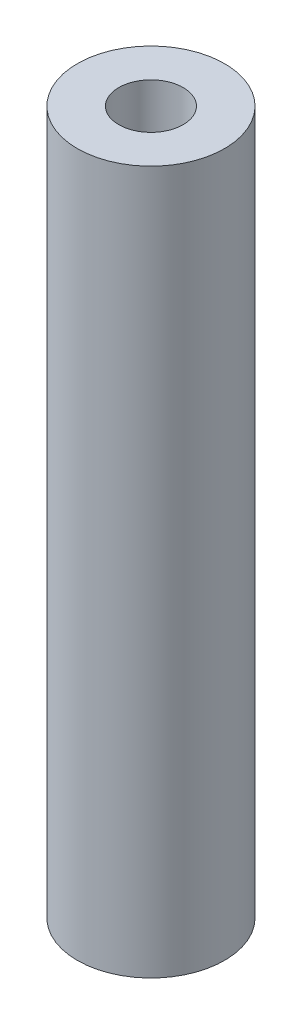
ISO-10303-21;
HEADER;
FILE_DESCRIPTION(('STEP AP214'),'2;1');
FILE_NAME('part.step','',(''),(''),'','','');
FILE_SCHEMA(('AUTOMOTIVE_DESIGN { 1 0 10303 214 1 1 1 1 }'));
ENDSEC;
DATA;
#1=APPLICATION_CONTEXT('core data for automotive mechanical design processes');
#2=APPLICATION_PROTOCOL_DEFINITION('international standard','automotive_design',2000,#1);
#3=PRODUCT_CONTEXT('',#1,'mechanical');
#4=PRODUCT('Part','Part','',(#3));
#5=PRODUCT_RELATED_PRODUCT_CATEGORY('part','',(#4));
#6=PRODUCT_DEFINITION_FORMATION('','',#4);
#7=PRODUCT_DEFINITION_CONTEXT('part definition',#1,'design');
#8=PRODUCT_DEFINITION('design','',#6,#7);
#9=PRODUCT_DEFINITION_SHAPE('','',#8);
#10=(LENGTH_UNIT() NAMED_UNIT(*) SI_UNIT(.MILLI.,.METRE.));
#11=(NAMED_UNIT(*) PLANE_ANGLE_UNIT() SI_UNIT($,.RADIAN.));
#12=(NAMED_UNIT(*) SI_UNIT($,.STERADIAN.) SOLID_ANGLE_UNIT());
#13=UNCERTAINTY_MEASURE_WITH_UNIT(LENGTH_MEASURE(1.E-05),#10,'distance_accuracy_value','');
#14=(GEOMETRIC_REPRESENTATION_CONTEXT(3) GLOBAL_UNCERTAINTY_ASSIGNED_CONTEXT((#13)) GLOBAL_UNIT_ASSIGNED_CONTEXT((#10,
#11,#12)) REPRESENTATION_CONTEXT('',''));
#15=CARTESIAN_POINT('',(0.,0.,0.));
#16=DIRECTION('',(0.,0.,1.));
#17=DIRECTION('',(1.,0.,0.));
#18=AXIS2_PLACEMENT_3D('',#15,#16,#17);
#19=CARTESIAN_POINT('',(0.,38.2,0.));
#20=DIRECTION('',(0.,1.,0.));
#21=DIRECTION('',(0.,0.,1.));
#22=AXIS2_PLACEMENT_3D('',#19,#20,#21);
#23=PLANE('',#22);
#24=CARTESIAN_POINT('',(0.,38.2,0.));
#25=DIRECTION('',(0.,1.,0.));
#26=DIRECTION('',(0.,0.,1.));
#27=AXIS2_PLACEMENT_3D('',#24,#25,#26);
#28=CIRCLE('',#27,4.);
#29=CARTESIAN_POINT('',(0.,38.2,4.));
#30=VERTEX_POINT('',#29);
#31=EDGE_CURVE('E10',#30,#30,#28,.T.);
#32=ORIENTED_EDGE('',*,*,#31,.T.);
#33=EDGE_LOOP('',(#32));
#34=FACE_BOUND('',#33,.T.);
#35=CARTESIAN_POINT('',(0.,38.2,0.));
#36=DIRECTION('',(0.,1.,0.));
#37=DIRECTION('',(0.,0.,1.));
#38=AXIS2_PLACEMENT_3D('',#35,#36,#37);
#39=CIRCLE('',#38,1.75);
#40=CARTESIAN_POINT('',(0.,38.2,1.75));
#41=VERTEX_POINT('',#40);
#42=EDGE_CURVE('E56',#41,#41,#39,.T.);
#43=ORIENTED_EDGE('',*,*,#42,.F.);
#44=EDGE_LOOP('',(#43));
#45=FACE_BOUND('',#44,.T.);
#46=ADVANCED_FACE('F43',(#34,#45),#23,.T.);
#47=CARTESIAN_POINT('',(0.,0.,0.));
#48=DIRECTION('',(0.,1.,0.));
#49=DIRECTION('',(0.,0.,1.));
#50=AXIS2_PLACEMENT_3D('',#47,#48,#49);
#51=PLANE('',#50);
#52=CARTESIAN_POINT('',(0.,0.,0.));
#53=DIRECTION('',(0.,1.,0.));
#54=DIRECTION('',(0.,0.,1.));
#55=AXIS2_PLACEMENT_3D('',#52,#53,#54);
#56=CIRCLE('',#55,4.);
#57=CARTESIAN_POINT('',(0.,0.,4.));
#58=VERTEX_POINT('',#57);
#59=EDGE_CURVE('E47',#58,#58,#56,.T.);
#60=ORIENTED_EDGE('',*,*,#59,.F.);
#61=EDGE_LOOP('',(#60));
#62=FACE_BOUND('',#61,.T.);
#63=CARTESIAN_POINT('',(0.,0.,0.));
#64=DIRECTION('',(0.,1.,0.));
#65=DIRECTION('',(0.,0.,1.));
#66=AXIS2_PLACEMENT_3D('',#63,#64,#65);
#67=CIRCLE('',#66,1.75);
#68=CARTESIAN_POINT('',(0.,0.,1.75));
#69=VERTEX_POINT('',#68);
#70=EDGE_CURVE('E58',#69,#69,#67,.T.);
#71=ORIENTED_EDGE('',*,*,#70,.T.);
#72=EDGE_LOOP('',(#71));
#73=FACE_BOUND('',#72,.T.);
#74=ADVANCED_FACE('F70',(#62,#73),#51,.F.);
#75=CARTESIAN_POINT('',(0.,38.2,0.));
#76=DIRECTION('',(0.,-1.,0.));
#77=DIRECTION('',(0.,0.,-1.));
#78=AXIS2_PLACEMENT_3D('',#75,#76,#77);
#79=CYLINDRICAL_SURFACE('',#78,4.);
#80=ORIENTED_EDGE('',*,*,#31,.F.);
#81=EDGE_LOOP('',(#80));
#82=FACE_BOUND('',#81,.T.);
#83=ORIENTED_EDGE('',*,*,#59,.T.);
#84=EDGE_LOOP('',(#83));
#85=FACE_BOUND('',#84,.T.);
#86=ADVANCED_FACE('F45',(#82,#85),#79,.T.);
#87=CARTESIAN_POINT('',(0.,38.2,0.));
#88=DIRECTION('',(0.,-1.,0.));
#89=DIRECTION('',(0.,0.,-1.));
#90=AXIS2_PLACEMENT_3D('',#87,#88,#89);
#91=CYLINDRICAL_SURFACE('',#90,1.75);
#92=ORIENTED_EDGE('',*,*,#42,.T.);
#93=EDGE_LOOP('',(#92));
#94=FACE_BOUND('',#93,.T.);
#95=ORIENTED_EDGE('',*,*,#70,.F.);
#96=EDGE_LOOP('',(#95));
#97=FACE_BOUND('',#96,.T.);
#98=ADVANCED_FACE('F66',(#94,#97),#91,.F.);
#99=CLOSED_SHELL('',(#46,#74,#86,#98));
#100=MANIFOLD_SOLID_BREP('B2',#99);
#101=ADVANCED_BREP_SHAPE_REPRESENTATION('',(#18,#100),#14);
#102=SHAPE_DEFINITION_REPRESENTATION(#9,#101);
ENDSEC;
END-ISO-10303-21;
